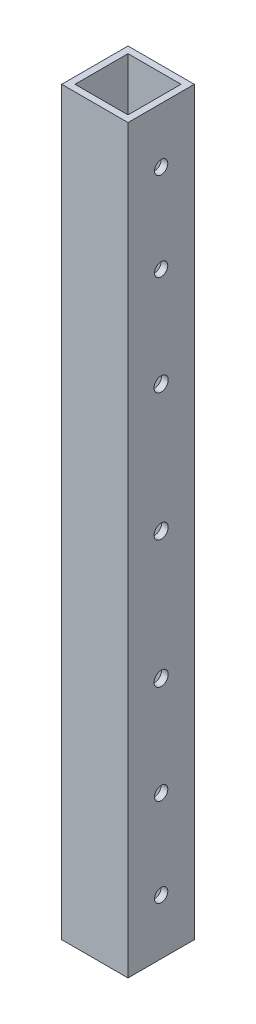
ISO-10303-21;
HEADER;
FILE_DESCRIPTION(('STEP AP214'),'2;1');
FILE_NAME('part.step','',(''),(''),'','','');
FILE_SCHEMA(('AUTOMOTIVE_DESIGN { 1 0 10303 214 1 1 1 1 }'));
ENDSEC;
DATA;
#1=APPLICATION_CONTEXT('core data for automotive mechanical design processes');
#2=APPLICATION_PROTOCOL_DEFINITION('international standard','automotive_design',2000,#1);
#3=PRODUCT_CONTEXT('',#1,'mechanical');
#4=PRODUCT('Part','Part','',(#3));
#5=PRODUCT_RELATED_PRODUCT_CATEGORY('part','',(#4));
#6=PRODUCT_DEFINITION_FORMATION('','',#4);
#7=PRODUCT_DEFINITION_CONTEXT('part definition',#1,'design');
#8=PRODUCT_DEFINITION('design','',#6,#7);
#9=PRODUCT_DEFINITION_SHAPE('','',#8);
#10=(LENGTH_UNIT() NAMED_UNIT(*) SI_UNIT(.MILLI.,.METRE.));
#11=(NAMED_UNIT(*) PLANE_ANGLE_UNIT() SI_UNIT($,.RADIAN.));
#12=(NAMED_UNIT(*) SI_UNIT($,.STERADIAN.) SOLID_ANGLE_UNIT());
#13=UNCERTAINTY_MEASURE_WITH_UNIT(LENGTH_MEASURE(1.E-05),#10,'distance_accuracy_value','');
#14=(GEOMETRIC_REPRESENTATION_CONTEXT(3) GLOBAL_UNCERTAINTY_ASSIGNED_CONTEXT((#13)) GLOBAL_UNIT_ASSIGNED_CONTEXT((#10,
#11,#12)) REPRESENTATION_CONTEXT('',''));
#15=CARTESIAN_POINT('',(0.,0.,0.));
#16=DIRECTION('',(0.,0.,1.));
#17=DIRECTION('',(1.,0.,0.));
#18=AXIS2_PLACEMENT_3D('',#15,#16,#17);
#19=CARTESIAN_POINT('',(0.,167.65,0.));
#20=DIRECTION('',(0.,-1.,0.));
#21=DIRECTION('',(0.,0.,-1.));
#22=AXIS2_PLACEMENT_3D('',#19,#20,#21);
#23=PLANE('',#22);
#24=DIRECTION('',(0.,0.,1.));
#25=VECTOR('',#24,1.);
#26=CARTESIAN_POINT('',(0.,167.65,0.));
#27=LINE('',#26,#25);
#28=CARTESIAN_POINT('',(0.,167.65,-15.));
#29=VERTEX_POINT('',#28);
#30=CARTESIAN_POINT('',(0.,167.65,0.));
#31=VERTEX_POINT('',#30);
#32=EDGE_CURVE('E149',#29,#31,#27,.T.);
#33=ORIENTED_EDGE('',*,*,#32,.T.);
#34=DIRECTION('',(1.,0.,0.));
#35=VECTOR('',#34,1.);
#36=CARTESIAN_POINT('',(0.,167.65,0.));
#37=LINE('',#36,#35);
#38=CARTESIAN_POINT('',(15.,167.65,0.));
#39=VERTEX_POINT('',#38);
#40=EDGE_CURVE('E152',#31,#39,#37,.T.);
#41=ORIENTED_EDGE('',*,*,#40,.T.);
#42=DIRECTION('',(0.,0.,-1.));
#43=VECTOR('',#42,1.);
#44=CARTESIAN_POINT('',(15.,167.65,0.));
#45=LINE('',#44,#43);
#46=CARTESIAN_POINT('',(15.,167.65,-15.));
#47=VERTEX_POINT('',#46);
#48=EDGE_CURVE('E155',#39,#47,#45,.T.);
#49=ORIENTED_EDGE('',*,*,#48,.T.);
#50=DIRECTION('',(-1.,0.,0.));
#51=VECTOR('',#50,1.);
#52=CARTESIAN_POINT('',(0.,167.65,-15.));
#53=LINE('',#52,#51);
#54=EDGE_CURVE('E157',#47,#29,#53,.T.);
#55=ORIENTED_EDGE('',*,*,#54,.T.);
#56=EDGE_LOOP('',(#33,#41,#49,#55));
#57=FACE_BOUND('',#56,.T.);
#58=DIRECTION('',(1.,0.,0.));
#59=VECTOR('',#58,1.);
#60=CARTESIAN_POINT('',(1.5,167.65,-1.5));
#61=LINE('',#60,#59);
#62=CARTESIAN_POINT('',(1.5,167.65,-1.5));
#63=VERTEX_POINT('',#62);
#64=CARTESIAN_POINT('',(13.5,167.65,-1.5));
#65=VERTEX_POINT('',#64);
#66=EDGE_CURVE('E111',#63,#65,#61,.T.);
#67=ORIENTED_EDGE('',*,*,#66,.F.);
#68=DIRECTION('',(0.,0.,1.));
#69=VECTOR('',#68,1.);
#70=CARTESIAN_POINT('',(1.5,167.65,-1.5));
#71=LINE('',#70,#69);
#72=CARTESIAN_POINT('',(1.5,167.65,-13.5));
#73=VERTEX_POINT('',#72);
#74=EDGE_CURVE('E133',#73,#63,#71,.T.);
#75=ORIENTED_EDGE('',*,*,#74,.F.);
#76=DIRECTION('',(-1.,0.,0.));
#77=VECTOR('',#76,1.);
#78=CARTESIAN_POINT('',(1.5,167.65,-13.5));
#79=LINE('',#78,#77);
#80=CARTESIAN_POINT('',(13.5,167.65,-13.5));
#81=VERTEX_POINT('',#80);
#82=EDGE_CURVE('E131',#81,#73,#79,.T.);
#83=ORIENTED_EDGE('',*,*,#82,.F.);
#84=DIRECTION('',(0.,0.,-1.));
#85=VECTOR('',#84,1.);
#86=CARTESIAN_POINT('',(13.5,167.65,-1.5));
#87=LINE('',#86,#85);
#88=EDGE_CURVE('E119',#65,#81,#87,.T.);
#89=ORIENTED_EDGE('',*,*,#88,.F.);
#90=EDGE_LOOP('',(#67,#75,#83,#89));
#91=FACE_BOUND('',#90,.T.);
#92=ADVANCED_FACE('F44',(#57,#91),#23,.F.);
#93=CARTESIAN_POINT('',(0.,0.,0.));
#94=DIRECTION('',(0.,-1.,0.));
#95=DIRECTION('',(0.,0.,-1.));
#96=AXIS2_PLACEMENT_3D('',#93,#94,#95);
#97=PLANE('',#96);
#98=DIRECTION('',(0.,0.,1.));
#99=VECTOR('',#98,1.);
#100=CARTESIAN_POINT('',(0.,0.,0.));
#101=LINE('',#100,#99);
#102=CARTESIAN_POINT('',(0.,0.,-15.));
#103=VERTEX_POINT('',#102);
#104=CARTESIAN_POINT('',(0.,0.,0.));
#105=VERTEX_POINT('',#104);
#106=EDGE_CURVE('E127',#103,#105,#101,.T.);
#107=ORIENTED_EDGE('',*,*,#106,.F.);
#108=DIRECTION('',(-1.,0.,0.));
#109=VECTOR('',#108,1.);
#110=CARTESIAN_POINT('',(0.,0.,-15.));
#111=LINE('',#110,#109);
#112=CARTESIAN_POINT('',(15.,0.,-15.));
#113=VERTEX_POINT('',#112);
#114=EDGE_CURVE('E153',#113,#103,#111,.T.);
#115=ORIENTED_EDGE('',*,*,#114,.F.);
#116=DIRECTION('',(0.,0.,-1.));
#117=VECTOR('',#116,1.);
#118=CARTESIAN_POINT('',(15.,0.,0.));
#119=LINE('',#118,#117);
#120=CARTESIAN_POINT('',(15.,0.,0.));
#121=VERTEX_POINT('',#120);
#122=EDGE_CURVE('E164',#121,#113,#119,.T.);
#123=ORIENTED_EDGE('',*,*,#122,.F.);
#124=DIRECTION('',(1.,0.,0.));
#125=VECTOR('',#124,1.);
#126=CARTESIAN_POINT('',(0.,0.,0.));
#127=LINE('',#126,#125);
#128=EDGE_CURVE('E162',#105,#121,#127,.T.);
#129=ORIENTED_EDGE('',*,*,#128,.F.);
#130=EDGE_LOOP('',(#107,#115,#123,#129));
#131=FACE_BOUND('',#130,.T.);
#132=DIRECTION('',(0.,0.,1.));
#133=VECTOR('',#132,1.);
#134=CARTESIAN_POINT('',(1.5,0.,-1.5));
#135=LINE('',#134,#133);
#136=CARTESIAN_POINT('',(1.5,0.,-13.5));
#137=VERTEX_POINT('',#136);
#138=CARTESIAN_POINT('',(1.5,0.,-1.5));
#139=VERTEX_POINT('',#138);
#140=EDGE_CURVE('E120',#137,#139,#135,.T.);
#141=ORIENTED_EDGE('',*,*,#140,.T.);
#142=DIRECTION('',(1.,0.,0.));
#143=VECTOR('',#142,1.);
#144=CARTESIAN_POINT('',(1.5,0.,-1.5));
#145=LINE('',#144,#143);
#146=CARTESIAN_POINT('',(13.5,0.,-1.5));
#147=VERTEX_POINT('',#146);
#148=EDGE_CURVE('E69',#139,#147,#145,.T.);
#149=ORIENTED_EDGE('',*,*,#148,.T.);
#150=DIRECTION('',(0.,0.,-1.));
#151=VECTOR('',#150,1.);
#152=CARTESIAN_POINT('',(13.5,0.,-1.5));
#153=LINE('',#152,#151);
#154=CARTESIAN_POINT('',(13.5,0.,-13.5));
#155=VERTEX_POINT('',#154);
#156=EDGE_CURVE('E126',#147,#155,#153,.T.);
#157=ORIENTED_EDGE('',*,*,#156,.T.);
#158=DIRECTION('',(-1.,0.,0.));
#159=VECTOR('',#158,1.);
#160=CARTESIAN_POINT('',(1.5,0.,-13.5));
#161=LINE('',#160,#159);
#162=EDGE_CURVE('E141',#155,#137,#161,.T.);
#163=ORIENTED_EDGE('',*,*,#162,.T.);
#164=EDGE_LOOP('',(#141,#149,#157,#163));
#165=FACE_BOUND('',#164,.T.);
#166=ADVANCED_FACE('F234',(#131,#165),#97,.T.);
#167=CARTESIAN_POINT('',(0.,167.65,0.));
#168=DIRECTION('',(1.,0.,0.));
#169=DIRECTION('',(0.,0.,-1.));
#170=AXIS2_PLACEMENT_3D('',#167,#168,#169);
#171=PLANE('',#170);
#172=CARTESIAN_POINT('',(0.,155.150000000001,-7.49999999999945));
#173=DIRECTION('',(-1.,0.,0.));
#174=DIRECTION('',(0.,0.,1.));
#175=AXIS2_PLACEMENT_3D('',#172,#173,#174);
#176=CIRCLE('',#175,1.5);
#177=CARTESIAN_POINT('',(0.,155.150000000001,-5.99999999999945));
#178=VERTEX_POINT('',#177);
#179=EDGE_CURVE('E285',#178,#178,#176,.T.);
#180=ORIENTED_EDGE('',*,*,#179,.F.);
#181=EDGE_LOOP('',(#180));
#182=FACE_BOUND('',#181,.T.);
#183=CARTESIAN_POINT('',(0.,135.150000000001,-7.49999999999923));
#184=DIRECTION('',(-1.,0.,0.));
#185=DIRECTION('',(0.,0.,1.));
#186=AXIS2_PLACEMENT_3D('',#183,#184,#185);
#187=CIRCLE('',#186,1.5);
#188=CARTESIAN_POINT('',(0.,135.150000000001,-5.99999999999923));
#189=VERTEX_POINT('',#188);
#190=EDGE_CURVE('E289',#189,#189,#187,.T.);
#191=ORIENTED_EDGE('',*,*,#190,.F.);
#192=EDGE_LOOP('',(#191));
#193=FACE_BOUND('',#192,.T.);
#194=CARTESIAN_POINT('',(0.,112.675,-7.49999999999999));
#195=DIRECTION('',(-1.,0.,0.));
#196=DIRECTION('',(0.,0.,1.));
#197=AXIS2_PLACEMENT_3D('',#194,#195,#196);
#198=CIRCLE('',#197,1.60000000000001);
#199=CARTESIAN_POINT('',(0.,112.675,-5.89999999999999));
#200=VERTEX_POINT('',#199);
#201=EDGE_CURVE('E293',#200,#200,#198,.T.);
#202=ORIENTED_EDGE('',*,*,#201,.F.);
#203=EDGE_LOOP('',(#202));
#204=FACE_BOUND('',#203,.T.);
#205=CARTESIAN_POINT('',(0.,83.825,-7.49999999999999));
#206=DIRECTION('',(-1.,0.,0.));
#207=DIRECTION('',(0.,0.,1.));
#208=AXIS2_PLACEMENT_3D('',#205,#206,#207);
#209=CIRCLE('',#208,1.60000000000001);
#210=CARTESIAN_POINT('',(0.,83.825,-5.89999999999999));
#211=VERTEX_POINT('',#210);
#212=EDGE_CURVE('E297',#211,#211,#209,.T.);
#213=ORIENTED_EDGE('',*,*,#212,.F.);
#214=EDGE_LOOP('',(#213));
#215=FACE_BOUND('',#214,.T.);
#216=CARTESIAN_POINT('',(0.,54.975,-7.49999999999999));
#217=DIRECTION('',(-1.,0.,0.));
#218=DIRECTION('',(0.,0.,1.));
#219=AXIS2_PLACEMENT_3D('',#216,#217,#218);
#220=CIRCLE('',#219,1.60000000000001);
#221=CARTESIAN_POINT('',(0.,54.975,-5.89999999999999));
#222=VERTEX_POINT('',#221);
#223=EDGE_CURVE('E301',#222,#222,#220,.T.);
#224=ORIENTED_EDGE('',*,*,#223,.F.);
#225=EDGE_LOOP('',(#224));
#226=FACE_BOUND('',#225,.T.);
#227=CARTESIAN_POINT('',(0.,32.5000000000007,-7.49999999999664));
#228=DIRECTION('',(-1.,0.,0.));
#229=DIRECTION('',(0.,0.,1.));
#230=AXIS2_PLACEMENT_3D('',#227,#228,#229);
#231=CIRCLE('',#230,1.5);
#232=CARTESIAN_POINT('',(0.,32.5000000000007,-5.99999999999663));
#233=VERTEX_POINT('',#232);
#234=EDGE_CURVE('E305',#233,#233,#231,.T.);
#235=ORIENTED_EDGE('',*,*,#234,.F.);
#236=EDGE_LOOP('',(#235));
#237=FACE_BOUND('',#236,.T.);
#238=CARTESIAN_POINT('',(0.,12.5000000000007,-7.49999999999664));
#239=DIRECTION('',(-1.,0.,0.));
#240=DIRECTION('',(0.,0.,1.));
#241=AXIS2_PLACEMENT_3D('',#238,#239,#240);
#242=CIRCLE('',#241,1.5);
#243=CARTESIAN_POINT('',(0.,12.5000000000007,-5.99999999999664));
#244=VERTEX_POINT('',#243);
#245=EDGE_CURVE('E308',#244,#244,#242,.T.);
#246=ORIENTED_EDGE('',*,*,#245,.F.);
#247=EDGE_LOOP('',(#246));
#248=FACE_BOUND('',#247,.T.);
#249=ORIENTED_EDGE('',*,*,#106,.T.);
#250=DIRECTION('',(0.,-1.,0.));
#251=VECTOR('',#250,1.);
#252=CARTESIAN_POINT('',(0.,167.65,0.));
#253=LINE('',#252,#251);
#254=EDGE_CURVE('E11',#31,#105,#253,.T.);
#255=ORIENTED_EDGE('',*,*,#254,.F.);
#256=ORIENTED_EDGE('',*,*,#32,.F.);
#257=DIRECTION('',(0.,-1.,0.));
#258=VECTOR('',#257,1.);
#259=CARTESIAN_POINT('',(0.,167.65,-15.));
#260=LINE('',#259,#258);
#261=EDGE_CURVE('E159',#29,#103,#260,.T.);
#262=ORIENTED_EDGE('',*,*,#261,.T.);
#263=EDGE_LOOP('',(#249,#255,#256,#262));
#264=FACE_BOUND('',#263,.T.);
#265=ADVANCED_FACE('F46',(#182,#193,#204,#215,#226,#237,#248,#264),#171,.F.);
#266=CARTESIAN_POINT('',(0.,167.65,0.));
#267=DIRECTION('',(0.,0.,-1.));
#268=DIRECTION('',(-1.,0.,0.));
#269=AXIS2_PLACEMENT_3D('',#266,#267,#268);
#270=PLANE('',#269);
#271=ORIENTED_EDGE('',*,*,#128,.T.);
#272=DIRECTION('',(0.,-1.,0.));
#273=VECTOR('',#272,1.);
#274=CARTESIAN_POINT('',(15.,167.65,0.));
#275=LINE('',#274,#273);
#276=EDGE_CURVE('E53',#39,#121,#275,.T.);
#277=ORIENTED_EDGE('',*,*,#276,.F.);
#278=ORIENTED_EDGE('',*,*,#40,.F.);
#279=ORIENTED_EDGE('',*,*,#254,.T.);
#280=EDGE_LOOP('',(#271,#277,#278,#279));
#281=FACE_BOUND('',#280,.T.);
#282=ADVANCED_FACE('F261',(#281),#270,.F.);
#283=CARTESIAN_POINT('',(15.,167.65,0.));
#284=DIRECTION('',(-1.,0.,0.));
#285=DIRECTION('',(0.,0.,1.));
#286=AXIS2_PLACEMENT_3D('',#283,#284,#285);
#287=PLANE('',#286);
#288=CARTESIAN_POINT('',(15.,155.150000000001,-7.49999999999945));
#289=DIRECTION('',(-1.,0.,0.));
#290=DIRECTION('',(0.,0.,1.));
#291=AXIS2_PLACEMENT_3D('',#288,#289,#290);
#292=CIRCLE('',#291,1.5);
#293=CARTESIAN_POINT('',(15.,155.150000000001,-5.99999999999945));
#294=VERTEX_POINT('',#293);
#295=EDGE_CURVE('E178',#294,#294,#292,.T.);
#296=ORIENTED_EDGE('',*,*,#295,.T.);
#297=EDGE_LOOP('',(#296));
#298=FACE_BOUND('',#297,.T.);
#299=CARTESIAN_POINT('',(15.,135.150000000001,-7.49999999999923));
#300=DIRECTION('',(-1.,0.,0.));
#301=DIRECTION('',(0.,0.,1.));
#302=AXIS2_PLACEMENT_3D('',#299,#300,#301);
#303=CIRCLE('',#302,1.5);
#304=CARTESIAN_POINT('',(15.,135.150000000001,-5.99999999999923));
#305=VERTEX_POINT('',#304);
#306=EDGE_CURVE('E389',#305,#305,#303,.T.);
#307=ORIENTED_EDGE('',*,*,#306,.T.);
#308=EDGE_LOOP('',(#307));
#309=FACE_BOUND('',#308,.T.);
#310=CARTESIAN_POINT('',(15.,112.675,-7.49999999999999));
#311=DIRECTION('',(-1.,0.,0.));
#312=DIRECTION('',(0.,0.,1.));
#313=AXIS2_PLACEMENT_3D('',#310,#311,#312);
#314=CIRCLE('',#313,1.60000000000001);
#315=CARTESIAN_POINT('',(15.,112.675,-5.89999999999999));
#316=VERTEX_POINT('',#315);
#317=EDGE_CURVE('E393',#316,#316,#314,.T.);
#318=ORIENTED_EDGE('',*,*,#317,.T.);
#319=EDGE_LOOP('',(#318));
#320=FACE_BOUND('',#319,.T.);
#321=CARTESIAN_POINT('',(15.,83.825,-7.49999999999999));
#322=DIRECTION('',(-1.,0.,0.));
#323=DIRECTION('',(0.,0.,1.));
#324=AXIS2_PLACEMENT_3D('',#321,#322,#323);
#325=CIRCLE('',#324,1.60000000000001);
#326=CARTESIAN_POINT('',(15.,83.825,-5.89999999999999));
#327=VERTEX_POINT('',#326);
#328=EDGE_CURVE('E400',#327,#327,#325,.T.);
#329=ORIENTED_EDGE('',*,*,#328,.T.);
#330=EDGE_LOOP('',(#329));
#331=FACE_BOUND('',#330,.T.);
#332=CARTESIAN_POINT('',(15.,54.975,-7.49999999999999));
#333=DIRECTION('',(-1.,0.,0.));
#334=DIRECTION('',(0.,0.,1.));
#335=AXIS2_PLACEMENT_3D('',#332,#333,#334);
#336=CIRCLE('',#335,1.60000000000001);
#337=CARTESIAN_POINT('',(15.,54.975,-5.89999999999999));
#338=VERTEX_POINT('',#337);
#339=EDGE_CURVE('E404',#338,#338,#336,.T.);
#340=ORIENTED_EDGE('',*,*,#339,.T.);
#341=EDGE_LOOP('',(#340));
#342=FACE_BOUND('',#341,.T.);
#343=CARTESIAN_POINT('',(15.,32.5000000000007,-7.49999999999664));
#344=DIRECTION('',(-1.,0.,0.));
#345=DIRECTION('',(0.,0.,1.));
#346=AXIS2_PLACEMENT_3D('',#343,#344,#345);
#347=CIRCLE('',#346,1.5);
#348=CARTESIAN_POINT('',(15.,32.5000000000007,-5.99999999999663));
#349=VERTEX_POINT('',#348);
#350=EDGE_CURVE('E310',#349,#349,#347,.T.);
#351=ORIENTED_EDGE('',*,*,#350,.T.);
#352=EDGE_LOOP('',(#351));
#353=FACE_BOUND('',#352,.T.);
#354=CARTESIAN_POINT('',(15.,12.5000000000007,-7.49999999999664));
#355=DIRECTION('',(-1.,0.,0.));
#356=DIRECTION('',(0.,0.,1.));
#357=AXIS2_PLACEMENT_3D('',#354,#355,#356);
#358=CIRCLE('',#357,1.5);
#359=CARTESIAN_POINT('',(15.,12.5000000000007,-5.99999999999664));
#360=VERTEX_POINT('',#359);
#361=EDGE_CURVE('E311',#360,#360,#358,.T.);
#362=ORIENTED_EDGE('',*,*,#361,.T.);
#363=EDGE_LOOP('',(#362));
#364=FACE_BOUND('',#363,.T.);
#365=ORIENTED_EDGE('',*,*,#122,.T.);
#366=DIRECTION('',(0.,-1.,0.));
#367=VECTOR('',#366,1.);
#368=CARTESIAN_POINT('',(15.,167.65,-15.));
#369=LINE('',#368,#367);
#370=EDGE_CURVE('E169',#47,#113,#369,.T.);
#371=ORIENTED_EDGE('',*,*,#370,.F.);
#372=ORIENTED_EDGE('',*,*,#48,.F.);
#373=ORIENTED_EDGE('',*,*,#276,.T.);
#374=EDGE_LOOP('',(#365,#371,#372,#373));
#375=FACE_BOUND('',#374,.T.);
#376=ADVANCED_FACE('F258',(#298,#309,#320,#331,#342,#353,#364,#375),#287,.F.);
#377=CARTESIAN_POINT('',(0.,167.65,-15.));
#378=DIRECTION('',(0.,0.,1.));
#379=DIRECTION('',(1.,0.,0.));
#380=AXIS2_PLACEMENT_3D('',#377,#378,#379);
#381=PLANE('',#380);
#382=ORIENTED_EDGE('',*,*,#114,.T.);
#383=ORIENTED_EDGE('',*,*,#261,.F.);
#384=ORIENTED_EDGE('',*,*,#54,.F.);
#385=ORIENTED_EDGE('',*,*,#370,.T.);
#386=EDGE_LOOP('',(#382,#383,#384,#385));
#387=FACE_BOUND('',#386,.T.);
#388=ADVANCED_FACE('F255',(#387),#381,.F.);
#389=CARTESIAN_POINT('',(1.5,167.65,-1.5));
#390=DIRECTION('',(0.,0.,-1.));
#391=DIRECTION('',(-1.,0.,0.));
#392=AXIS2_PLACEMENT_3D('',#389,#390,#391);
#393=PLANE('',#392);
#394=ORIENTED_EDGE('',*,*,#148,.F.);
#395=DIRECTION('',(0.,-1.,0.));
#396=VECTOR('',#395,1.);
#397=CARTESIAN_POINT('',(1.5,167.65,-1.5));
#398=LINE('',#397,#396);
#399=EDGE_CURVE('E115',#63,#139,#398,.T.);
#400=ORIENTED_EDGE('',*,*,#399,.F.);
#401=ORIENTED_EDGE('',*,*,#66,.T.);
#402=DIRECTION('',(0.,-1.,0.));
#403=VECTOR('',#402,1.);
#404=CARTESIAN_POINT('',(13.5,167.65,-1.5));
#405=LINE('',#404,#403);
#406=EDGE_CURVE('E114',#65,#147,#405,.T.);
#407=ORIENTED_EDGE('',*,*,#406,.T.);
#408=EDGE_LOOP('',(#394,#400,#401,#407));
#409=FACE_BOUND('',#408,.T.);
#410=ADVANCED_FACE('F113',(#409),#393,.T.);
#411=CARTESIAN_POINT('',(13.5,167.65,-1.5));
#412=DIRECTION('',(-1.,0.,0.));
#413=DIRECTION('',(0.,0.,1.));
#414=AXIS2_PLACEMENT_3D('',#411,#412,#413);
#415=PLANE('',#414);
#416=CARTESIAN_POINT('',(13.5,155.150000000001,-7.49999999999945));
#417=DIRECTION('',(-1.,0.,0.));
#418=DIRECTION('',(0.,0.,1.));
#419=AXIS2_PLACEMENT_3D('',#416,#417,#418);
#420=CIRCLE('',#419,1.5);
#421=CARTESIAN_POINT('',(13.5,155.150000000001,-5.99999999999945));
#422=VERTEX_POINT('',#421);
#423=EDGE_CURVE('E139',#422,#422,#420,.T.);
#424=ORIENTED_EDGE('',*,*,#423,.F.);
#425=EDGE_LOOP('',(#424));
#426=FACE_BOUND('',#425,.T.);
#427=CARTESIAN_POINT('',(13.5,135.150000000001,-7.49999999999923));
#428=DIRECTION('',(-1.,0.,0.));
#429=DIRECTION('',(0.,0.,1.));
#430=AXIS2_PLACEMENT_3D('',#427,#428,#429);
#431=CIRCLE('',#430,1.5);
#432=CARTESIAN_POINT('',(13.5,135.150000000001,-5.99999999999923));
#433=VERTEX_POINT('',#432);
#434=EDGE_CURVE('E196',#433,#433,#431,.T.);
#435=ORIENTED_EDGE('',*,*,#434,.F.);
#436=EDGE_LOOP('',(#435));
#437=FACE_BOUND('',#436,.T.);
#438=CARTESIAN_POINT('',(13.5,112.675,-7.49999999999999));
#439=DIRECTION('',(-1.,0.,0.));
#440=DIRECTION('',(0.,0.,1.));
#441=AXIS2_PLACEMENT_3D('',#438,#439,#440);
#442=CIRCLE('',#441,1.60000000000001);
#443=CARTESIAN_POINT('',(13.5,112.675,-5.89999999999999));
#444=VERTEX_POINT('',#443);
#445=EDGE_CURVE('E193',#444,#444,#442,.T.);
#446=ORIENTED_EDGE('',*,*,#445,.F.);
#447=EDGE_LOOP('',(#446));
#448=FACE_BOUND('',#447,.T.);
#449=CARTESIAN_POINT('',(13.5,83.825,-7.49999999999999));
#450=DIRECTION('',(-1.,0.,0.));
#451=DIRECTION('',(0.,0.,1.));
#452=AXIS2_PLACEMENT_3D('',#449,#450,#451);
#453=CIRCLE('',#452,1.60000000000001);
#454=CARTESIAN_POINT('',(13.5,83.825,-5.89999999999999));
#455=VERTEX_POINT('',#454);
#456=EDGE_CURVE('E190',#455,#455,#453,.T.);
#457=ORIENTED_EDGE('',*,*,#456,.F.);
#458=EDGE_LOOP('',(#457));
#459=FACE_BOUND('',#458,.T.);
#460=CARTESIAN_POINT('',(13.5,54.975,-7.49999999999999));
#461=DIRECTION('',(-1.,0.,0.));
#462=DIRECTION('',(0.,0.,1.));
#463=AXIS2_PLACEMENT_3D('',#460,#461,#462);
#464=CIRCLE('',#463,1.60000000000001);
#465=CARTESIAN_POINT('',(13.5,54.975,-5.89999999999999));
#466=VERTEX_POINT('',#465);
#467=EDGE_CURVE('E186',#466,#466,#464,.T.);
#468=ORIENTED_EDGE('',*,*,#467,.F.);
#469=EDGE_LOOP('',(#468));
#470=FACE_BOUND('',#469,.T.);
#471=CARTESIAN_POINT('',(13.5,32.5000000000007,-7.49999999999664));
#472=DIRECTION('',(-1.,0.,0.));
#473=DIRECTION('',(0.,0.,1.));
#474=AXIS2_PLACEMENT_3D('',#471,#472,#473);
#475=CIRCLE('',#474,1.5);
#476=CARTESIAN_POINT('',(13.5,32.5000000000007,-5.99999999999663));
#477=VERTEX_POINT('',#476);
#478=EDGE_CURVE('E182',#477,#477,#475,.T.);
#479=ORIENTED_EDGE('',*,*,#478,.F.);
#480=EDGE_LOOP('',(#479));
#481=FACE_BOUND('',#480,.T.);
#482=CARTESIAN_POINT('',(13.5,12.5000000000007,-7.49999999999664));
#483=DIRECTION('',(-1.,0.,0.));
#484=DIRECTION('',(0.,0.,1.));
#485=AXIS2_PLACEMENT_3D('',#482,#483,#484);
#486=CIRCLE('',#485,1.5);
#487=CARTESIAN_POINT('',(13.5,12.5000000000007,-5.99999999999664));
#488=VERTEX_POINT('',#487);
#489=EDGE_CURVE('E177',#488,#488,#486,.T.);
#490=ORIENTED_EDGE('',*,*,#489,.F.);
#491=EDGE_LOOP('',(#490));
#492=FACE_BOUND('',#491,.T.);
#493=ORIENTED_EDGE('',*,*,#156,.F.);
#494=ORIENTED_EDGE('',*,*,#406,.F.);
#495=ORIENTED_EDGE('',*,*,#88,.T.);
#496=DIRECTION('',(0.,-1.,0.));
#497=VECTOR('',#496,1.);
#498=CARTESIAN_POINT('',(13.5,167.65,-13.5));
#499=LINE('',#498,#497);
#500=EDGE_CURVE('E128',#81,#155,#499,.T.);
#501=ORIENTED_EDGE('',*,*,#500,.T.);
#502=EDGE_LOOP('',(#493,#494,#495,#501));
#503=FACE_BOUND('',#502,.T.);
#504=ADVANCED_FACE('F123',(#426,#437,#448,#459,#470,#481,#492,#503),#415,.T.);
#505=CARTESIAN_POINT('',(1.5,167.65,-13.5));
#506=DIRECTION('',(0.,0.,1.));
#507=DIRECTION('',(1.,0.,0.));
#508=AXIS2_PLACEMENT_3D('',#505,#506,#507);
#509=PLANE('',#508);
#510=ORIENTED_EDGE('',*,*,#162,.F.);
#511=ORIENTED_EDGE('',*,*,#500,.F.);
#512=ORIENTED_EDGE('',*,*,#82,.T.);
#513=DIRECTION('',(0.,-1.,0.));
#514=VECTOR('',#513,1.);
#515=CARTESIAN_POINT('',(1.5,167.65,-13.5));
#516=LINE('',#515,#514);
#517=EDGE_CURVE('E61',#73,#137,#516,.T.);
#518=ORIENTED_EDGE('',*,*,#517,.T.);
#519=EDGE_LOOP('',(#510,#511,#512,#518));
#520=FACE_BOUND('',#519,.T.);
#521=ADVANCED_FACE('F220',(#520),#509,.T.);
#522=CARTESIAN_POINT('',(1.5,167.65,-1.5));
#523=DIRECTION('',(1.,0.,0.));
#524=DIRECTION('',(0.,0.,-1.));
#525=AXIS2_PLACEMENT_3D('',#522,#523,#524);
#526=PLANE('',#525);
#527=CARTESIAN_POINT('',(1.5,155.150000000001,-7.49999999999945));
#528=DIRECTION('',(1.,0.,0.));
#529=DIRECTION('',(0.,0.,-1.));
#530=AXIS2_PLACEMENT_3D('',#527,#528,#529);
#531=CIRCLE('',#530,1.5);
#532=CARTESIAN_POINT('',(1.5,155.150000000001,-8.99999999999945));
#533=VERTEX_POINT('',#532);
#534=EDGE_CURVE('E48',#533,#533,#531,.T.);
#535=ORIENTED_EDGE('',*,*,#534,.F.);
#536=EDGE_LOOP('',(#535));
#537=FACE_BOUND('',#536,.T.);
#538=CARTESIAN_POINT('',(1.5,135.150000000001,-7.49999999999923));
#539=DIRECTION('',(1.,0.,0.));
#540=DIRECTION('',(0.,0.,-1.));
#541=AXIS2_PLACEMENT_3D('',#538,#539,#540);
#542=CIRCLE('',#541,1.5);
#543=CARTESIAN_POINT('',(1.5,135.150000000001,-8.99999999999924));
#544=VERTEX_POINT('',#543);
#545=EDGE_CURVE('E194',#544,#544,#542,.T.);
#546=ORIENTED_EDGE('',*,*,#545,.F.);
#547=EDGE_LOOP('',(#546));
#548=FACE_BOUND('',#547,.T.);
#549=CARTESIAN_POINT('',(1.5,112.675,-7.49999999999999));
#550=DIRECTION('',(1.,0.,0.));
#551=DIRECTION('',(0.,0.,-1.));
#552=AXIS2_PLACEMENT_3D('',#549,#550,#551);
#553=CIRCLE('',#552,1.60000000000001);
#554=CARTESIAN_POINT('',(1.5,112.675,-9.1));
#555=VERTEX_POINT('',#554);
#556=EDGE_CURVE('E191',#555,#555,#553,.T.);
#557=ORIENTED_EDGE('',*,*,#556,.F.);
#558=EDGE_LOOP('',(#557));
#559=FACE_BOUND('',#558,.T.);
#560=CARTESIAN_POINT('',(1.5,83.825,-7.49999999999999));
#561=DIRECTION('',(1.,0.,0.));
#562=DIRECTION('',(0.,0.,-1.));
#563=AXIS2_PLACEMENT_3D('',#560,#561,#562);
#564=CIRCLE('',#563,1.60000000000001);
#565=CARTESIAN_POINT('',(1.5,83.825,-9.1));
#566=VERTEX_POINT('',#565);
#567=EDGE_CURVE('E187',#566,#566,#564,.T.);
#568=ORIENTED_EDGE('',*,*,#567,.F.);
#569=EDGE_LOOP('',(#568));
#570=FACE_BOUND('',#569,.T.);
#571=CARTESIAN_POINT('',(1.5,54.975,-7.49999999999999));
#572=DIRECTION('',(1.,0.,0.));
#573=DIRECTION('',(0.,0.,-1.));
#574=AXIS2_PLACEMENT_3D('',#571,#572,#573);
#575=CIRCLE('',#574,1.60000000000001);
#576=CARTESIAN_POINT('',(1.5,54.975,-9.1));
#577=VERTEX_POINT('',#576);
#578=EDGE_CURVE('E183',#577,#577,#575,.T.);
#579=ORIENTED_EDGE('',*,*,#578,.F.);
#580=EDGE_LOOP('',(#579));
#581=FACE_BOUND('',#580,.T.);
#582=CARTESIAN_POINT('',(1.5,32.5000000000007,-7.49999999999664));
#583=DIRECTION('',(1.,0.,0.));
#584=DIRECTION('',(0.,0.,-1.));
#585=AXIS2_PLACEMENT_3D('',#582,#583,#584);
#586=CIRCLE('',#585,1.5);
#587=CARTESIAN_POINT('',(1.5,32.5000000000007,-8.99999999999664));
#588=VERTEX_POINT('',#587);
#589=EDGE_CURVE('E179',#588,#588,#586,.T.);
#590=ORIENTED_EDGE('',*,*,#589,.F.);
#591=EDGE_LOOP('',(#590));
#592=FACE_BOUND('',#591,.T.);
#593=CARTESIAN_POINT('',(1.5,12.5000000000007,-7.49999999999664));
#594=DIRECTION('',(1.,0.,0.));
#595=DIRECTION('',(0.,0.,-1.));
#596=AXIS2_PLACEMENT_3D('',#593,#594,#595);
#597=CIRCLE('',#596,1.5);
#598=CARTESIAN_POINT('',(1.5,12.5000000000007,-8.99999999999664));
#599=VERTEX_POINT('',#598);
#600=EDGE_CURVE('E174',#599,#599,#597,.T.);
#601=ORIENTED_EDGE('',*,*,#600,.F.);
#602=EDGE_LOOP('',(#601));
#603=FACE_BOUND('',#602,.T.);
#604=ORIENTED_EDGE('',*,*,#140,.F.);
#605=ORIENTED_EDGE('',*,*,#517,.F.);
#606=ORIENTED_EDGE('',*,*,#74,.T.);
#607=ORIENTED_EDGE('',*,*,#399,.T.);
#608=EDGE_LOOP('',(#604,#605,#606,#607));
#609=FACE_BOUND('',#608,.T.);
#610=ADVANCED_FACE('F216',(#537,#548,#559,#570,#581,#592,#603,#609),#526,.T.);
#611=CARTESIAN_POINT('',(15.,12.5000000000007,-7.49999999999664));
#612=DIRECTION('',(-1.,0.,0.));
#613=DIRECTION('',(0.,0.,1.));
#614=AXIS2_PLACEMENT_3D('',#611,#612,#613);
#615=CYLINDRICAL_SURFACE('',#614,1.5);
#616=ORIENTED_EDGE('',*,*,#600,.T.);
#617=EDGE_LOOP('',(#616));
#618=FACE_BOUND('',#617,.T.);
#619=ORIENTED_EDGE('',*,*,#245,.T.);
#620=EDGE_LOOP('',(#619));
#621=FACE_BOUND('',#620,.T.);
#622=ADVANCED_FACE('F219',(#618,#621),#615,.F.);
#623=CARTESIAN_POINT('',(15.,32.5000000000007,-7.49999999999664));
#624=DIRECTION('',(-1.,0.,0.));
#625=DIRECTION('',(0.,0.,1.));
#626=AXIS2_PLACEMENT_3D('',#623,#624,#625);
#627=CYLINDRICAL_SURFACE('',#626,1.5);
#628=ORIENTED_EDGE('',*,*,#589,.T.);
#629=EDGE_LOOP('',(#628));
#630=FACE_BOUND('',#629,.T.);
#631=ORIENTED_EDGE('',*,*,#234,.T.);
#632=EDGE_LOOP('',(#631));
#633=FACE_BOUND('',#632,.T.);
#634=ADVANCED_FACE('F346',(#630,#633),#627,.F.);
#635=CARTESIAN_POINT('',(15.,54.975,-7.49999999999999));
#636=DIRECTION('',(-1.,0.,0.));
#637=DIRECTION('',(0.,0.,1.));
#638=AXIS2_PLACEMENT_3D('',#635,#636,#637);
#639=CYLINDRICAL_SURFACE('',#638,1.60000000000001);
#640=ORIENTED_EDGE('',*,*,#578,.T.);
#641=EDGE_LOOP('',(#640));
#642=FACE_BOUND('',#641,.T.);
#643=ORIENTED_EDGE('',*,*,#223,.T.);
#644=EDGE_LOOP('',(#643));
#645=FACE_BOUND('',#644,.T.);
#646=ADVANCED_FACE('F355',(#642,#645),#639,.F.);
#647=CARTESIAN_POINT('',(15.,83.825,-7.49999999999999));
#648=DIRECTION('',(-1.,0.,0.));
#649=DIRECTION('',(0.,0.,1.));
#650=AXIS2_PLACEMENT_3D('',#647,#648,#649);
#651=CYLINDRICAL_SURFACE('',#650,1.60000000000001);
#652=ORIENTED_EDGE('',*,*,#567,.T.);
#653=EDGE_LOOP('',(#652));
#654=FACE_BOUND('',#653,.T.);
#655=ORIENTED_EDGE('',*,*,#212,.T.);
#656=EDGE_LOOP('',(#655));
#657=FACE_BOUND('',#656,.T.);
#658=ADVANCED_FACE('F360',(#654,#657),#651,.F.);
#659=CARTESIAN_POINT('',(15.,112.675,-7.49999999999999));
#660=DIRECTION('',(-1.,0.,0.));
#661=DIRECTION('',(0.,0.,1.));
#662=AXIS2_PLACEMENT_3D('',#659,#660,#661);
#663=CYLINDRICAL_SURFACE('',#662,1.60000000000001);
#664=ORIENTED_EDGE('',*,*,#556,.T.);
#665=EDGE_LOOP('',(#664));
#666=FACE_BOUND('',#665,.T.);
#667=ORIENTED_EDGE('',*,*,#201,.T.);
#668=EDGE_LOOP('',(#667));
#669=FACE_BOUND('',#668,.T.);
#670=ADVANCED_FACE('F367',(#666,#669),#663,.F.);
#671=CARTESIAN_POINT('',(15.,135.150000000001,-7.49999999999923));
#672=DIRECTION('',(-1.,0.,0.));
#673=DIRECTION('',(0.,0.,1.));
#674=AXIS2_PLACEMENT_3D('',#671,#672,#673);
#675=CYLINDRICAL_SURFACE('',#674,1.5);
#676=ORIENTED_EDGE('',*,*,#545,.T.);
#677=EDGE_LOOP('',(#676));
#678=FACE_BOUND('',#677,.T.);
#679=ORIENTED_EDGE('',*,*,#190,.T.);
#680=EDGE_LOOP('',(#679));
#681=FACE_BOUND('',#680,.T.);
#682=ADVANCED_FACE('F347',(#678,#681),#675,.F.);
#683=CARTESIAN_POINT('',(15.,155.150000000001,-7.49999999999945));
#684=DIRECTION('',(-1.,0.,0.));
#685=DIRECTION('',(0.,0.,1.));
#686=AXIS2_PLACEMENT_3D('',#683,#684,#685);
#687=CYLINDRICAL_SURFACE('',#686,1.5);
#688=ORIENTED_EDGE('',*,*,#534,.T.);
#689=EDGE_LOOP('',(#688));
#690=FACE_BOUND('',#689,.T.);
#691=ORIENTED_EDGE('',*,*,#179,.T.);
#692=EDGE_LOOP('',(#691));
#693=FACE_BOUND('',#692,.T.);
#694=ADVANCED_FACE('F213',(#690,#693),#687,.F.);
#695=ORIENTED_EDGE('',*,*,#489,.T.);
#696=EDGE_LOOP('',(#695));
#697=FACE_BOUND('',#696,.T.);
#698=ORIENTED_EDGE('',*,*,#361,.F.);
#699=EDGE_LOOP('',(#698));
#700=FACE_BOUND('',#699,.T.);
#701=ADVANCED_FACE('F333',(#697,#700),#615,.F.);
#702=ORIENTED_EDGE('',*,*,#478,.T.);
#703=EDGE_LOOP('',(#702));
#704=FACE_BOUND('',#703,.T.);
#705=ORIENTED_EDGE('',*,*,#350,.F.);
#706=EDGE_LOOP('',(#705));
#707=FACE_BOUND('',#706,.T.);
#708=ADVANCED_FACE('F336',(#704,#707),#627,.F.);
#709=ORIENTED_EDGE('',*,*,#467,.T.);
#710=EDGE_LOOP('',(#709));
#711=FACE_BOUND('',#710,.T.);
#712=ORIENTED_EDGE('',*,*,#339,.F.);
#713=EDGE_LOOP('',(#712));
#714=FACE_BOUND('',#713,.T.);
#715=ADVANCED_FACE('F325',(#711,#714),#639,.F.);
#716=ORIENTED_EDGE('',*,*,#456,.T.);
#717=EDGE_LOOP('',(#716));
#718=FACE_BOUND('',#717,.T.);
#719=ORIENTED_EDGE('',*,*,#328,.F.);
#720=EDGE_LOOP('',(#719));
#721=FACE_BOUND('',#720,.T.);
#722=ADVANCED_FACE('F369',(#718,#721),#651,.F.);
#723=ORIENTED_EDGE('',*,*,#445,.T.);
#724=EDGE_LOOP('',(#723));
#725=FACE_BOUND('',#724,.T.);
#726=ORIENTED_EDGE('',*,*,#317,.F.);
#727=EDGE_LOOP('',(#726));
#728=FACE_BOUND('',#727,.T.);
#729=ADVANCED_FACE('F373',(#725,#728),#663,.F.);
#730=ORIENTED_EDGE('',*,*,#434,.T.);
#731=EDGE_LOOP('',(#730));
#732=FACE_BOUND('',#731,.T.);
#733=ORIENTED_EDGE('',*,*,#306,.F.);
#734=EDGE_LOOP('',(#733));
#735=FACE_BOUND('',#734,.T.);
#736=ADVANCED_FACE('F375',(#732,#735),#675,.F.);
#737=ORIENTED_EDGE('',*,*,#423,.T.);
#738=EDGE_LOOP('',(#737));
#739=FACE_BOUND('',#738,.T.);
#740=ORIENTED_EDGE('',*,*,#295,.F.);
#741=EDGE_LOOP('',(#740));
#742=FACE_BOUND('',#741,.T.);
#743=ADVANCED_FACE('F349',(#739,#742),#687,.F.);
#744=CLOSED_SHELL('',(#92,#166,#265,#282,#376,#388,#410,#504,#521,#610,#622,#634,#646,#658,#670,
#682,#694,#701,#708,#715,#722,#729,#736,#743));
#745=MANIFOLD_SOLID_BREP('B2',#744);
#746=ADVANCED_BREP_SHAPE_REPRESENTATION('',(#18,#745),#14);
#747=SHAPE_DEFINITION_REPRESENTATION(#9,#746);
ENDSEC;
END-ISO-10303-21;
